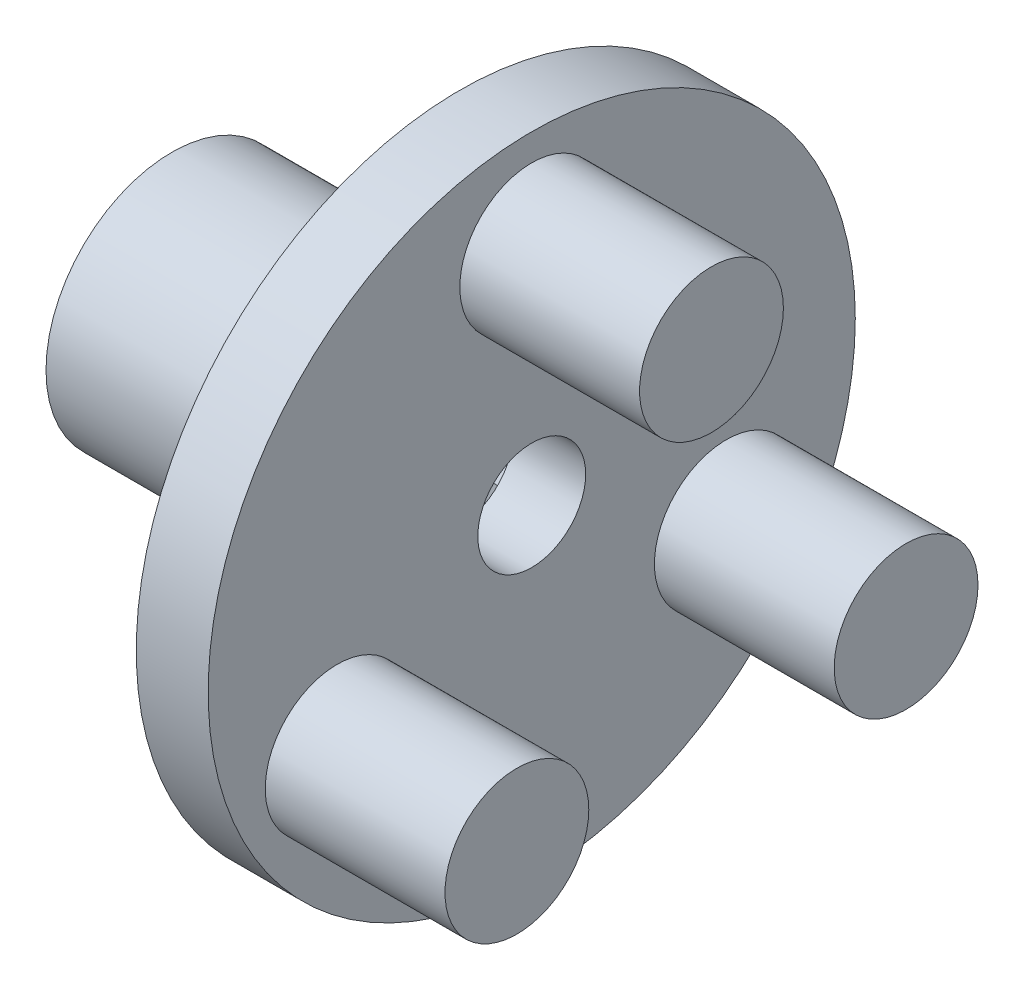
ISO-10303-21;
HEADER;
FILE_DESCRIPTION(('STEP AP214'),'2;1');
FILE_NAME('part.step','',(''),(''),'','','');
FILE_SCHEMA(('AUTOMOTIVE_DESIGN { 1 0 10303 214 1 1 1 1 }'));
ENDSEC;
DATA;
#1=APPLICATION_CONTEXT('core data for automotive mechanical design processes');
#2=APPLICATION_PROTOCOL_DEFINITION('international standard','automotive_design',2000,#1);
#3=PRODUCT_CONTEXT('',#1,'mechanical');
#4=PRODUCT('Part','Part','',(#3));
#5=PRODUCT_RELATED_PRODUCT_CATEGORY('part','',(#4));
#6=PRODUCT_DEFINITION_FORMATION('','',#4);
#7=PRODUCT_DEFINITION_CONTEXT('part definition',#1,'design');
#8=PRODUCT_DEFINITION('design','',#6,#7);
#9=PRODUCT_DEFINITION_SHAPE('','',#8);
#10=(LENGTH_UNIT() NAMED_UNIT(*) SI_UNIT(.MILLI.,.METRE.));
#11=(NAMED_UNIT(*) PLANE_ANGLE_UNIT() SI_UNIT($,.RADIAN.));
#12=(NAMED_UNIT(*) SI_UNIT($,.STERADIAN.) SOLID_ANGLE_UNIT());
#13=UNCERTAINTY_MEASURE_WITH_UNIT(LENGTH_MEASURE(1.E-05),#10,'distance_accuracy_value','');
#14=(GEOMETRIC_REPRESENTATION_CONTEXT(3) GLOBAL_UNCERTAINTY_ASSIGNED_CONTEXT((#13)) GLOBAL_UNIT_ASSIGNED_CONTEXT((#10,
#11,#12)) REPRESENTATION_CONTEXT('',''));
#15=CARTESIAN_POINT('',(0.,0.,0.));
#16=DIRECTION('',(0.,0.,1.));
#17=DIRECTION('',(1.,0.,0.));
#18=AXIS2_PLACEMENT_3D('',#15,#16,#17);
#19=CARTESIAN_POINT('',(2.,0.,0.));
#20=DIRECTION('',(-1.,0.,0.));
#21=DIRECTION('',(0.,0.,1.));
#22=AXIS2_PLACEMENT_3D('',#19,#20,#21);
#23=CYLINDRICAL_SURFACE('',#22,9.);
#24=CARTESIAN_POINT('',(2.,0.,0.));
#25=DIRECTION('',(1.,0.,0.));
#26=DIRECTION('',(0.,0.,-1.));
#27=AXIS2_PLACEMENT_3D('',#24,#25,#26);
#28=CIRCLE('',#27,9.);
#29=CARTESIAN_POINT('',(2.,0.,-9.));
#30=VERTEX_POINT('',#29);
#31=EDGE_CURVE('E49',#30,#30,#28,.T.);
#32=ORIENTED_EDGE('',*,*,#31,.F.);
#33=EDGE_LOOP('',(#32));
#34=FACE_BOUND('',#33,.T.);
#35=CARTESIAN_POINT('',(0.,0.,0.));
#36=DIRECTION('',(1.,0.,0.));
#37=DIRECTION('',(0.,0.,-1.));
#38=AXIS2_PLACEMENT_3D('',#35,#36,#37);
#39=CIRCLE('',#38,9.);
#40=CARTESIAN_POINT('',(0.,0.,-9.));
#41=VERTEX_POINT('',#40);
#42=EDGE_CURVE('E269',#41,#41,#39,.T.);
#43=ORIENTED_EDGE('',*,*,#42,.T.);
#44=EDGE_LOOP('',(#43));
#45=FACE_BOUND('',#44,.T.);
#46=ADVANCED_FACE('F41',(#34,#45),#23,.T.);
#47=CARTESIAN_POINT('',(2.,0.,0.));
#48=DIRECTION('',(1.,0.,0.));
#49=DIRECTION('',(0.,0.,-1.));
#50=AXIS2_PLACEMENT_3D('',#47,#48,#49);
#51=PLANE('',#50);
#52=CARTESIAN_POINT('',(2.,0.,0.));
#53=DIRECTION('',(1.,0.,0.));
#54=DIRECTION('',(0.,0.,-1.));
#55=AXIS2_PLACEMENT_3D('',#52,#53,#54);
#56=CIRCLE('',#55,1.5);
#57=CARTESIAN_POINT('',(2.,0.,-1.5));
#58=VERTEX_POINT('',#57);
#59=EDGE_CURVE('E176',#58,#58,#56,.F.);
#60=ORIENTED_EDGE('',*,*,#59,.T.);
#61=EDGE_LOOP('',(#60));
#62=FACE_BOUND('',#61,.T.);
#63=CARTESIAN_POINT('',(2.,-3.12499999999977,-5.41265877365314));
#64=DIRECTION('',(1.,0.,0.));
#65=DIRECTION('',(0.,0.,-1.));
#66=AXIS2_PLACEMENT_3D('',#63,#64,#65);
#67=CIRCLE('',#66,2.);
#68=CARTESIAN_POINT('',(2.,-3.12499999999977,-7.41265877365314));
#69=VERTEX_POINT('',#68);
#70=EDGE_CURVE('E248',#69,#69,#67,.T.);
#71=ORIENTED_EDGE('',*,*,#70,.F.);
#72=EDGE_LOOP('',(#71));
#73=FACE_BOUND('',#72,.T.);
#74=CARTESIAN_POINT('',(2.,-3.12500000000023,5.41265877365234));
#75=DIRECTION('',(1.,0.,0.));
#76=DIRECTION('',(0.,0.,-1.));
#77=AXIS2_PLACEMENT_3D('',#74,#75,#76);
#78=CIRCLE('',#77,2.);
#79=CARTESIAN_POINT('',(2.,-3.12500000000023,3.41265877365234));
#80=VERTEX_POINT('',#79);
#81=EDGE_CURVE('E253',#80,#80,#78,.T.);
#82=ORIENTED_EDGE('',*,*,#81,.F.);
#83=EDGE_LOOP('',(#82));
#84=FACE_BOUND('',#83,.T.);
#85=CARTESIAN_POINT('',(2.,6.25,0.));
#86=DIRECTION('',(1.,0.,0.));
#87=DIRECTION('',(0.,0.,-1.));
#88=AXIS2_PLACEMENT_3D('',#85,#86,#87);
#89=CIRCLE('',#88,2.);
#90=CARTESIAN_POINT('',(2.,6.25,-2.));
#91=VERTEX_POINT('',#90);
#92=EDGE_CURVE('E261',#91,#91,#89,.T.);
#93=ORIENTED_EDGE('',*,*,#92,.F.);
#94=EDGE_LOOP('',(#93));
#95=FACE_BOUND('',#94,.T.);
#96=ORIENTED_EDGE('',*,*,#31,.T.);
#97=EDGE_LOOP('',(#96));
#98=FACE_BOUND('',#97,.T.);
#99=ADVANCED_FACE('F283',(#62,#73,#84,#95,#98),#51,.T.);
#100=CARTESIAN_POINT('',(0.,0.,0.));
#101=DIRECTION('',(1.,0.,0.));
#102=DIRECTION('',(0.,0.,-1.));
#103=AXIS2_PLACEMENT_3D('',#100,#101,#102);
#104=PLANE('',#103);
#105=CARTESIAN_POINT('',(0.,0.,0.));
#106=DIRECTION('',(1.,0.,0.));
#107=DIRECTION('',(0.,0.,-1.));
#108=AXIS2_PLACEMENT_3D('',#105,#106,#107);
#109=CIRCLE('',#108,5.);
#110=CARTESIAN_POINT('',(0.,0.,-5.));
#111=VERTEX_POINT('',#110);
#112=EDGE_CURVE('E11',#111,#111,#109,.F.);
#113=ORIENTED_EDGE('',*,*,#112,.F.);
#114=EDGE_LOOP('',(#113));
#115=FACE_BOUND('',#114,.T.);
#116=ORIENTED_EDGE('',*,*,#42,.F.);
#117=EDGE_LOOP('',(#116));
#118=FACE_BOUND('',#117,.T.);
#119=ADVANCED_FACE('F280',(#115,#118),#104,.F.);
#120=CARTESIAN_POINT('',(7.,6.25,0.));
#121=DIRECTION('',(-1.,0.,0.));
#122=DIRECTION('',(0.,0.,1.));
#123=AXIS2_PLACEMENT_3D('',#120,#121,#122);
#124=CYLINDRICAL_SURFACE('',#123,2.);
#125=CARTESIAN_POINT('',(7.,6.25,0.));
#126=DIRECTION('',(1.,0.,0.));
#127=DIRECTION('',(0.,0.,-1.));
#128=AXIS2_PLACEMENT_3D('',#125,#126,#127);
#129=CIRCLE('',#128,2.);
#130=CARTESIAN_POINT('',(7.,6.25,-2.));
#131=VERTEX_POINT('',#130);
#132=EDGE_CURVE('E265',#131,#131,#129,.T.);
#133=ORIENTED_EDGE('',*,*,#132,.F.);
#134=EDGE_LOOP('',(#133));
#135=FACE_BOUND('',#134,.T.);
#136=ORIENTED_EDGE('',*,*,#92,.T.);
#137=EDGE_LOOP('',(#136));
#138=FACE_BOUND('',#137,.T.);
#139=ADVANCED_FACE('F282',(#135,#138),#124,.T.);
#140=CARTESIAN_POINT('',(7.,6.25,0.));
#141=DIRECTION('',(1.,0.,0.));
#142=DIRECTION('',(0.,0.,-1.));
#143=AXIS2_PLACEMENT_3D('',#140,#141,#142);
#144=PLANE('',#143);
#145=ORIENTED_EDGE('',*,*,#132,.T.);
#146=EDGE_LOOP('',(#145));
#147=FACE_BOUND('',#146,.T.);
#148=ADVANCED_FACE('F289',(#147),#144,.T.);
#149=CARTESIAN_POINT('',(7.,-3.12500000000023,5.41265877365234));
#150=DIRECTION('',(-1.,0.,0.));
#151=DIRECTION('',(0.,0.,1.));
#152=AXIS2_PLACEMENT_3D('',#149,#150,#151);
#153=CYLINDRICAL_SURFACE('',#152,2.);
#154=CARTESIAN_POINT('',(7.,-3.12500000000023,5.41265877365234));
#155=DIRECTION('',(1.,0.,0.));
#156=DIRECTION('',(0.,0.,-1.));
#157=AXIS2_PLACEMENT_3D('',#154,#155,#156);
#158=CIRCLE('',#157,2.);
#159=CARTESIAN_POINT('',(7.,-3.12500000000023,3.41265877365234));
#160=VERTEX_POINT('',#159);
#161=EDGE_CURVE('E257',#160,#160,#158,.T.);
#162=ORIENTED_EDGE('',*,*,#161,.F.);
#163=EDGE_LOOP('',(#162));
#164=FACE_BOUND('',#163,.T.);
#165=ORIENTED_EDGE('',*,*,#81,.T.);
#166=EDGE_LOOP('',(#165));
#167=FACE_BOUND('',#166,.T.);
#168=ADVANCED_FACE('F450',(#164,#167),#153,.T.);
#169=CARTESIAN_POINT('',(7.,-3.12500000000023,5.41265877365234));
#170=DIRECTION('',(1.,0.,0.));
#171=DIRECTION('',(0.,0.,-1.));
#172=AXIS2_PLACEMENT_3D('',#169,#170,#171);
#173=PLANE('',#172);
#174=ORIENTED_EDGE('',*,*,#161,.T.);
#175=EDGE_LOOP('',(#174));
#176=FACE_BOUND('',#175,.T.);
#177=ADVANCED_FACE('F452',(#176),#173,.T.);
#178=CARTESIAN_POINT('',(7.,-3.12499999999977,-5.41265877365314));
#179=DIRECTION('',(-1.,0.,0.));
#180=DIRECTION('',(0.,0.,1.));
#181=AXIS2_PLACEMENT_3D('',#178,#179,#180);
#182=CYLINDRICAL_SURFACE('',#181,2.);
#183=CARTESIAN_POINT('',(7.,-3.12499999999977,-5.41265877365314));
#184=DIRECTION('',(1.,0.,0.));
#185=DIRECTION('',(0.,0.,-1.));
#186=AXIS2_PLACEMENT_3D('',#183,#184,#185);
#187=CIRCLE('',#186,2.);
#188=CARTESIAN_POINT('',(7.,-3.12499999999977,-7.41265877365314));
#189=VERTEX_POINT('',#188);
#190=EDGE_CURVE('E249',#189,#189,#187,.T.);
#191=ORIENTED_EDGE('',*,*,#190,.F.);
#192=EDGE_LOOP('',(#191));
#193=FACE_BOUND('',#192,.T.);
#194=ORIENTED_EDGE('',*,*,#70,.T.);
#195=EDGE_LOOP('',(#194));
#196=FACE_BOUND('',#195,.T.);
#197=ADVANCED_FACE('F349',(#193,#196),#182,.T.);
#198=CARTESIAN_POINT('',(7.,-3.12499999999977,-5.41265877365314));
#199=DIRECTION('',(1.,0.,0.));
#200=DIRECTION('',(0.,0.,-1.));
#201=AXIS2_PLACEMENT_3D('',#198,#199,#200);
#202=PLANE('',#201);
#203=ORIENTED_EDGE('',*,*,#190,.T.);
#204=EDGE_LOOP('',(#203));
#205=FACE_BOUND('',#204,.T.);
#206=ADVANCED_FACE('F341',(#205),#202,.T.);
#207=CARTESIAN_POINT('',(-0.01,0.,0.));
#208=DIRECTION('',(-1.,0.,0.));
#209=DIRECTION('',(0.,0.,1.));
#210=AXIS2_PLACEMENT_3D('',#207,#208,#209);
#211=PLANE('',#210);
#212=CARTESIAN_POINT('',(-0.01,0.,0.));
#213=DIRECTION('',(-1.,0.,0.));
#214=DIRECTION('',(0.,0.,1.));
#215=AXIS2_PLACEMENT_3D('',#212,#213,#214);
#216=CIRCLE('',#215,3.5);
#217=CARTESIAN_POINT('',(-0.01,0.,3.5));
#218=VERTEX_POINT('',#217);
#219=EDGE_CURVE('E206',#218,#218,#216,.T.);
#220=ORIENTED_EDGE('',*,*,#219,.F.);
#221=EDGE_LOOP('',(#220));
#222=FACE_BOUND('',#221,.T.);
#223=CARTESIAN_POINT('',(-0.01,0.,0.));
#224=DIRECTION('',(-1.,0.,0.));
#225=DIRECTION('',(0.,0.,1.));
#226=AXIS2_PLACEMENT_3D('',#223,#224,#225);
#227=CIRCLE('',#226,5.);
#228=CARTESIAN_POINT('',(-0.01,0.,-5.));
#229=VERTEX_POINT('',#228);
#230=EDGE_CURVE('E244',#229,#229,#227,.T.);
#231=ORIENTED_EDGE('',*,*,#230,.T.);
#232=EDGE_LOOP('',(#231));
#233=FACE_BOUND('',#232,.T.);
#234=ADVANCED_FACE('F335',(#222,#233),#211,.T.);
#235=CARTESIAN_POINT('',(-0.01,0.,0.));
#236=DIRECTION('',(1.,0.,0.));
#237=DIRECTION('',(0.,0.,-1.));
#238=AXIS2_PLACEMENT_3D('',#235,#236,#237);
#239=CYLINDRICAL_SURFACE('',#238,5.);
#240=CARTESIAN_POINT('',(-0.01,0.,-5.));
#241=CARTESIAN_POINT('',(-0.00989583333333333,0.,-5.));
#242=CARTESIAN_POINT('',(-0.00979166666666667,0.,-5.));
#243=CARTESIAN_POINT('',(-0.00958333333333333,0.,-5.));
#244=CARTESIAN_POINT('',(-0.00947916666666667,0.,-5.));
#245=CARTESIAN_POINT('',(-0.00927083333333333,0.,-5.));
#246=CARTESIAN_POINT('',(-0.00916666666666667,0.,-5.));
#247=CARTESIAN_POINT('',(-0.00895833333333333,0.,-5.));
#248=CARTESIAN_POINT('',(-0.00885416666666667,0.,-5.));
#249=CARTESIAN_POINT('',(-0.00864583333333333,0.,-5.));
#250=CARTESIAN_POINT('',(-0.00854166666666667,0.,-5.));
#251=CARTESIAN_POINT('',(-0.00833333333333333,0.,-5.));
#252=CARTESIAN_POINT('',(-0.00822916666666667,0.,-5.));
#253=CARTESIAN_POINT('',(-0.00802083333333333,0.,-5.));
#254=CARTESIAN_POINT('',(-0.00791666666666667,0.,-5.));
#255=CARTESIAN_POINT('',(-0.00770833333333333,0.,-5.));
#256=CARTESIAN_POINT('',(-0.00760416666666667,0.,-5.));
#257=CARTESIAN_POINT('',(-0.00739583333333333,0.,-5.));
#258=CARTESIAN_POINT('',(-0.00729166666666667,0.,-5.));
#259=CARTESIAN_POINT('',(-0.00708333333333333,0.,-5.));
#260=CARTESIAN_POINT('',(-0.00697916666666667,0.,-5.));
#261=CARTESIAN_POINT('',(-0.00677083333333333,0.,-5.));
#262=CARTESIAN_POINT('',(-0.00666666666666667,0.,-5.));
#263=CARTESIAN_POINT('',(-0.00645833333333333,0.,-5.));
#264=CARTESIAN_POINT('',(-0.00635416666666667,0.,-5.));
#265=CARTESIAN_POINT('',(-0.00614583333333333,0.,-5.));
#266=CARTESIAN_POINT('',(-0.00604166666666667,0.,-5.));
#267=CARTESIAN_POINT('',(-0.00583333333333333,0.,-5.));
#268=CARTESIAN_POINT('',(-0.00572916666666667,0.,-5.));
#269=CARTESIAN_POINT('',(-0.00552083333333333,0.,-5.));
#270=CARTESIAN_POINT('',(-0.00541666666666667,0.,-5.));
#271=CARTESIAN_POINT('',(-0.00520833333333333,0.,-5.));
#272=CARTESIAN_POINT('',(-0.00510416666666667,0.,-5.));
#273=CARTESIAN_POINT('',(-0.00489583333333333,0.,-5.));
#274=CARTESIAN_POINT('',(-0.00479166666666667,0.,-5.));
#275=CARTESIAN_POINT('',(-0.00458333333333333,0.,-5.));
#276=CARTESIAN_POINT('',(-0.00447916666666667,0.,-5.));
#277=CARTESIAN_POINT('',(-0.00427083333333333,0.,-5.));
#278=CARTESIAN_POINT('',(-0.00416666666666667,0.,-5.));
#279=CARTESIAN_POINT('',(-0.00395833333333333,0.,-5.));
#280=CARTESIAN_POINT('',(-0.00385416666666667,0.,-5.));
#281=CARTESIAN_POINT('',(-0.00364583333333333,0.,-5.));
#282=CARTESIAN_POINT('',(-0.00354166666666667,0.,-5.));
#283=CARTESIAN_POINT('',(-0.00333333333333333,0.,-5.));
#284=CARTESIAN_POINT('',(-0.00322916666666667,0.,-5.));
#285=CARTESIAN_POINT('',(-0.00302083333333333,0.,-5.));
#286=CARTESIAN_POINT('',(-0.00291666666666667,0.,-5.));
#287=CARTESIAN_POINT('',(-0.00270833333333333,0.,-5.));
#288=CARTESIAN_POINT('',(-0.00260416666666667,0.,-5.));
#289=CARTESIAN_POINT('',(-0.00239583333333333,0.,-5.));
#290=CARTESIAN_POINT('',(-0.00229166666666667,0.,-5.));
#291=CARTESIAN_POINT('',(-0.00208333333333333,0.,-5.));
#292=CARTESIAN_POINT('',(-0.00197916666666667,0.,-5.));
#293=CARTESIAN_POINT('',(-0.00177083333333333,0.,-5.));
#294=CARTESIAN_POINT('',(-0.00166666666666667,0.,-5.));
#295=CARTESIAN_POINT('',(-0.00145833333333333,0.,-5.));
#296=CARTESIAN_POINT('',(-0.00135416666666667,0.,-5.));
#297=CARTESIAN_POINT('',(-0.00114583333333333,0.,-5.));
#298=CARTESIAN_POINT('',(-0.00104166666666667,0.,-5.));
#299=CARTESIAN_POINT('',(-0.000833333333333334,0.,-5.));
#300=CARTESIAN_POINT('',(-0.000729166666666667,0.,-5.));
#301=CARTESIAN_POINT('',(-0.000520833333333334,0.,-5.));
#302=CARTESIAN_POINT('',(-0.000416666666666667,0.,-5.));
#303=CARTESIAN_POINT('',(-0.000208333333333334,0.,-5.));
#304=CARTESIAN_POINT('',(-0.000104166666666667,0.,-5.));
#305=CARTESIAN_POINT('',(0.,0.,-5.));
#306=B_SPLINE_CURVE_WITH_KNOTS('',3,(#240,#241,#242,#243,#244,#245,#246,#247,#248,#249,#250,
#251,#252,#253,#254,#255,#256,#257,#258,#259,#260,#261,#262,#263,#264,#265,#266,#267,#268,#269,
#270,#271,#272,#273,#274,#275,#276,#277,#278,#279,#280,#281,#282,#283,#284,#285,#286,#287,#288,
#289,#290,#291,#292,#293,#294,#295,#296,#297,#298,#299,#300,#301,#302,#303,#304,#305),
.UNSPECIFIED.,.F.,.F.,(4,2,2,2,2,2,2,2,2,2,2,2,2,2,2,2,2,2,2,2,2,2,2,2,2,2,2,2,2,2,2,2,4),(0.,
0.000312499999999999,0.000624999999999998,0.000937499999999999,0.00125,0.0015625,0.001875,
0.0021875,0.0025,0.0028125,0.003125,0.0034375,0.00375,0.0040625,0.004375,0.0046875,0.005,
0.0053125,0.005625,0.0059375,0.00625,0.0065625,0.006875,0.0071875,0.0075,0.0078125,0.008125,
0.0084375,0.00875,0.0090625,0.009375,0.0096875,0.01),.UNSPECIFIED.);
#307=EDGE_CURVE('BSEAM340',#229,#111,#306,.T.);
#308=ORIENTED_EDGE('',*,*,#230,.F.);
#309=ORIENTED_EDGE('',*,*,#112,.T.);
#310=ORIENTED_EDGE('',*,*,#307,.T.);
#311=ORIENTED_EDGE('',*,*,#307,.F.);
#312=EDGE_LOOP('',(#308,#310,#309,#311));
#313=FACE_BOUND('',#312,.T.);
#314=ADVANCED_FACE('F340',(#313),#239,.T.);
#315=CARTESIAN_POINT('',(-8.01,0.,0.));
#316=DIRECTION('',(1.,0.,0.));
#317=DIRECTION('',(0.,0.,-1.));
#318=AXIS2_PLACEMENT_3D('',#315,#316,#317);
#319=CYLINDRICAL_SURFACE('',#318,2.6);
#320=CARTESIAN_POINT('',(-0.01,0.,0.));
#321=DIRECTION('',(-1.,0.,0.));
#322=DIRECTION('',(0.,0.,1.));
#323=AXIS2_PLACEMENT_3D('',#320,#321,#322);
#324=CIRCLE('',#323,2.6);
#325=CARTESIAN_POINT('',(-0.01,-1.20428047928488,2.30428047928488));
#326=VERTEX_POINT('',#325);
#327=CARTESIAN_POINT('',(-0.01,1.20428047928488,2.30428047928488));
#328=VERTEX_POINT('',#327);
#329=EDGE_CURVE('E171',#326,#328,#324,.T.);
#330=ORIENTED_EDGE('',*,*,#329,.F.);
#331=DIRECTION('',(1.,0.,0.));
#332=VECTOR('',#331,1.);
#333=CARTESIAN_POINT('',(-8.01,-1.20428047928488,2.30428047928488));
#334=LINE('',#333,#332);
#335=CARTESIAN_POINT('',(-8.01,-1.20428047928488,2.30428047928488));
#336=VERTEX_POINT('',#335);
#337=EDGE_CURVE('E110',#336,#326,#334,.T.);
#338=ORIENTED_EDGE('',*,*,#337,.F.);
#339=CARTESIAN_POINT('',(-8.01,0.,0.));
#340=DIRECTION('',(-1.,0.,0.));
#341=DIRECTION('',(0.,0.,1.));
#342=AXIS2_PLACEMENT_3D('',#339,#340,#341);
#343=CIRCLE('',#342,2.6);
#344=CARTESIAN_POINT('',(-8.01,1.20428047928488,2.30428047928488));
#345=VERTEX_POINT('',#344);
#346=EDGE_CURVE('E158',#336,#345,#343,.T.);
#347=ORIENTED_EDGE('',*,*,#346,.T.);
#348=DIRECTION('',(1.,0.,0.));
#349=VECTOR('',#348,1.);
#350=CARTESIAN_POINT('',(-8.01,1.20428047928488,2.30428047928488));
#351=LINE('',#350,#349);
#352=EDGE_CURVE('E105',#345,#328,#351,.T.);
#353=ORIENTED_EDGE('',*,*,#352,.T.);
#354=EDGE_LOOP('',(#330,#338,#347,#353));
#355=FACE_BOUND('',#354,.T.);
#356=ADVANCED_FACE('F347',(#355),#319,.F.);
#357=CARTESIAN_POINT('',(-8.01,-1.20428047928488,0.));
#358=DIRECTION('',(0.,1.,0.));
#359=DIRECTION('',(0.,0.,1.));
#360=AXIS2_PLACEMENT_3D('',#357,#358,#359);
#361=PLANE('',#360);
#362=DIRECTION('',(0.,0.,1.));
#363=VECTOR('',#362,1.);
#364=CARTESIAN_POINT('',(-0.01,-1.20428047928488,0.));
#365=LINE('',#364,#363);
#366=CARTESIAN_POINT('',(-0.01,-1.20428047928488,1.20428047928488));
#367=VERTEX_POINT('',#366);
#368=EDGE_CURVE('E175',#367,#326,#365,.T.);
#369=ORIENTED_EDGE('',*,*,#368,.F.);
#370=DIRECTION('',(1.,0.,0.));
#371=VECTOR('',#370,1.);
#372=CARTESIAN_POINT('',(-8.01,-1.20428047928488,1.20428047928488));
#373=LINE('',#372,#371);
#374=CARTESIAN_POINT('',(-8.01,-1.20428047928488,1.20428047928488));
#375=VERTEX_POINT('',#374);
#376=EDGE_CURVE('E235',#375,#367,#373,.T.);
#377=ORIENTED_EDGE('',*,*,#376,.F.);
#378=DIRECTION('',(0.,0.,1.));
#379=VECTOR('',#378,1.);
#380=CARTESIAN_POINT('',(-8.01,-1.20428047928488,0.));
#381=LINE('',#380,#379);
#382=EDGE_CURVE('E415',#375,#336,#381,.T.);
#383=ORIENTED_EDGE('',*,*,#382,.T.);
#384=ORIENTED_EDGE('',*,*,#337,.T.);
#385=EDGE_LOOP('',(#369,#377,#383,#384));
#386=FACE_BOUND('',#385,.T.);
#387=ADVANCED_FACE('F394',(#386),#361,.T.);
#388=CARTESIAN_POINT('',(-8.01,0.,1.20428047928488));
#389=DIRECTION('',(0.,0.,-1.));
#390=DIRECTION('',(-1.,0.,0.));
#391=AXIS2_PLACEMENT_3D('',#388,#389,#390);
#392=PLANE('',#391);
#393=DIRECTION('',(0.,1.,0.));
#394=VECTOR('',#393,1.);
#395=CARTESIAN_POINT('',(-0.01,0.,1.20428047928488));
#396=LINE('',#395,#394);
#397=CARTESIAN_POINT('',(-0.01,-2.30428047928488,1.20428047928488));
#398=VERTEX_POINT('',#397);
#399=EDGE_CURVE('E181',#398,#367,#396,.T.);
#400=ORIENTED_EDGE('',*,*,#399,.F.);
#401=DIRECTION('',(1.,0.,0.));
#402=VECTOR('',#401,1.);
#403=CARTESIAN_POINT('',(-8.01,-2.30428047928488,1.20428047928488));
#404=LINE('',#403,#402);
#405=CARTESIAN_POINT('',(-8.01,-2.30428047928488,1.20428047928488));
#406=VERTEX_POINT('',#405);
#407=EDGE_CURVE('E232',#406,#398,#404,.T.);
#408=ORIENTED_EDGE('',*,*,#407,.F.);
#409=DIRECTION('',(0.,1.,0.));
#410=VECTOR('',#409,1.);
#411=CARTESIAN_POINT('',(-8.01,0.,1.20428047928488));
#412=LINE('',#411,#410);
#413=EDGE_CURVE('E410',#406,#375,#412,.T.);
#414=ORIENTED_EDGE('',*,*,#413,.T.);
#415=ORIENTED_EDGE('',*,*,#376,.T.);
#416=EDGE_LOOP('',(#400,#408,#414,#415));
#417=FACE_BOUND('',#416,.T.);
#418=ADVANCED_FACE('F391',(#417),#392,.T.);
#419=CARTESIAN_POINT('',(-0.01,-2.30428047928488,-1.20428047928488));
#420=VERTEX_POINT('',#419);
#421=EDGE_CURVE('E177',#420,#398,#324,.T.);
#422=ORIENTED_EDGE('',*,*,#421,.F.);
#423=DIRECTION('',(1.,0.,0.));
#424=VECTOR('',#423,1.);
#425=CARTESIAN_POINT('',(-8.01,-2.30428047928488,-1.20428047928488));
#426=LINE('',#425,#424);
#427=CARTESIAN_POINT('',(-8.01,-2.30428047928488,-1.20428047928488));
#428=VERTEX_POINT('',#427);
#429=EDGE_CURVE('E229',#428,#420,#426,.T.);
#430=ORIENTED_EDGE('',*,*,#429,.F.);
#431=EDGE_CURVE('E414',#428,#406,#343,.T.);
#432=ORIENTED_EDGE('',*,*,#431,.T.);
#433=ORIENTED_EDGE('',*,*,#407,.T.);
#434=EDGE_LOOP('',(#422,#430,#432,#433));
#435=FACE_BOUND('',#434,.T.);
#436=ADVANCED_FACE('F389',(#435),#319,.F.);
#437=CARTESIAN_POINT('',(-8.01,0.,-1.20428047928488));
#438=DIRECTION('',(0.,0.,-1.));
#439=DIRECTION('',(-1.,0.,0.));
#440=AXIS2_PLACEMENT_3D('',#437,#438,#439);
#441=PLANE('',#440);
#442=DIRECTION('',(0.,1.,0.));
#443=VECTOR('',#442,1.);
#444=CARTESIAN_POINT('',(-0.01,0.,-1.20428047928488));
#445=LINE('',#444,#443);
#446=CARTESIAN_POINT('',(-0.01,-1.20428047928488,-1.20428047928488));
#447=VERTEX_POINT('',#446);
#448=EDGE_CURVE('E185',#420,#447,#445,.T.);
#449=ORIENTED_EDGE('',*,*,#448,.T.);
#450=DIRECTION('',(1.,0.,0.));
#451=VECTOR('',#450,1.);
#452=CARTESIAN_POINT('',(-8.01,-1.20428047928488,-1.20428047928488));
#453=LINE('',#452,#451);
#454=CARTESIAN_POINT('',(-8.01,-1.20428047928488,-1.20428047928488));
#455=VERTEX_POINT('',#454);
#456=EDGE_CURVE('E226',#455,#447,#453,.T.);
#457=ORIENTED_EDGE('',*,*,#456,.F.);
#458=DIRECTION('',(0.,1.,0.));
#459=VECTOR('',#458,1.);
#460=CARTESIAN_POINT('',(-8.01,0.,-1.20428047928488));
#461=LINE('',#460,#459);
#462=EDGE_CURVE('E419',#428,#455,#461,.T.);
#463=ORIENTED_EDGE('',*,*,#462,.F.);
#464=ORIENTED_EDGE('',*,*,#429,.T.);
#465=EDGE_LOOP('',(#449,#457,#463,#464));
#466=FACE_BOUND('',#465,.T.);
#467=ADVANCED_FACE('F385',(#466),#441,.F.);
#468=CARTESIAN_POINT('',(-8.01,-1.20428047928488,0.));
#469=DIRECTION('',(0.,1.,0.));
#470=DIRECTION('',(0.,0.,1.));
#471=AXIS2_PLACEMENT_3D('',#468,#469,#470);
#472=PLANE('',#471);
#473=DIRECTION('',(0.,0.,1.));
#474=VECTOR('',#473,1.);
#475=CARTESIAN_POINT('',(-0.01,-1.20428047928488,0.));
#476=LINE('',#475,#474);
#477=CARTESIAN_POINT('',(-0.01,-1.20428047928488,-2.30428047928488));
#478=VERTEX_POINT('',#477);
#479=EDGE_CURVE('E189',#478,#447,#476,.T.);
#480=ORIENTED_EDGE('',*,*,#479,.F.);
#481=DIRECTION('',(1.,0.,0.));
#482=VECTOR('',#481,1.);
#483=CARTESIAN_POINT('',(-8.01,-1.20428047928488,-2.30428047928488));
#484=LINE('',#483,#482);
#485=CARTESIAN_POINT('',(-8.01,-1.20428047928488,-2.30428047928488));
#486=VERTEX_POINT('',#485);
#487=EDGE_CURVE('E223',#486,#478,#484,.T.);
#488=ORIENTED_EDGE('',*,*,#487,.F.);
#489=DIRECTION('',(0.,0.,1.));
#490=VECTOR('',#489,1.);
#491=CARTESIAN_POINT('',(-8.01,-1.20428047928488,0.));
#492=LINE('',#491,#490);
#493=EDGE_CURVE('E424',#486,#455,#492,.T.);
#494=ORIENTED_EDGE('',*,*,#493,.T.);
#495=ORIENTED_EDGE('',*,*,#456,.T.);
#496=EDGE_LOOP('',(#480,#488,#494,#495));
#497=FACE_BOUND('',#496,.T.);
#498=ADVANCED_FACE('F382',(#497),#472,.T.);
#499=CARTESIAN_POINT('',(-0.01,1.20428047928488,-2.30428047928488));
#500=VERTEX_POINT('',#499);
#501=EDGE_CURVE('E193',#500,#478,#324,.T.);
#502=ORIENTED_EDGE('',*,*,#501,.F.);
#503=DIRECTION('',(1.,0.,0.));
#504=VECTOR('',#503,1.);
#505=CARTESIAN_POINT('',(-8.01,1.20428047928488,-2.30428047928488));
#506=LINE('',#505,#504);
#507=CARTESIAN_POINT('',(-8.01,1.20428047928488,-2.30428047928488));
#508=VERTEX_POINT('',#507);
#509=EDGE_CURVE('E220',#508,#500,#506,.T.);
#510=ORIENTED_EDGE('',*,*,#509,.F.);
#511=EDGE_CURVE('E157',#508,#486,#343,.T.);
#512=ORIENTED_EDGE('',*,*,#511,.T.);
#513=ORIENTED_EDGE('',*,*,#487,.T.);
#514=EDGE_LOOP('',(#502,#510,#512,#513));
#515=FACE_BOUND('',#514,.T.);
#516=ADVANCED_FACE('F374',(#515),#319,.F.);
#517=CARTESIAN_POINT('',(-8.01,1.20428047928488,0.));
#518=DIRECTION('',(0.,1.,0.));
#519=DIRECTION('',(0.,0.,1.));
#520=AXIS2_PLACEMENT_3D('',#517,#518,#519);
#521=PLANE('',#520);
#522=DIRECTION('',(0.,0.,1.));
#523=VECTOR('',#522,1.);
#524=CARTESIAN_POINT('',(-0.01,1.20428047928488,0.));
#525=LINE('',#524,#523);
#526=CARTESIAN_POINT('',(-0.01,1.20428047928488,-1.20428047928488));
#527=VERTEX_POINT('',#526);
#528=EDGE_CURVE('E194',#500,#527,#525,.T.);
#529=ORIENTED_EDGE('',*,*,#528,.T.);
#530=DIRECTION('',(1.,0.,0.));
#531=VECTOR('',#530,1.);
#532=CARTESIAN_POINT('',(-8.01,1.20428047928488,-1.20428047928488));
#533=LINE('',#532,#531);
#534=CARTESIAN_POINT('',(-8.01,1.20428047928488,-1.20428047928488));
#535=VERTEX_POINT('',#534);
#536=EDGE_CURVE('E216',#535,#527,#533,.T.);
#537=ORIENTED_EDGE('',*,*,#536,.F.);
#538=DIRECTION('',(0.,0.,1.));
#539=VECTOR('',#538,1.);
#540=CARTESIAN_POINT('',(-8.01,1.20428047928488,0.));
#541=LINE('',#540,#539);
#542=EDGE_CURVE('E427',#508,#535,#541,.T.);
#543=ORIENTED_EDGE('',*,*,#542,.F.);
#544=ORIENTED_EDGE('',*,*,#509,.T.);
#545=EDGE_LOOP('',(#529,#537,#543,#544));
#546=FACE_BOUND('',#545,.T.);
#547=ADVANCED_FACE('F377',(#546),#521,.F.);
#548=CARTESIAN_POINT('',(-8.01,0.,-1.20428047928488));
#549=DIRECTION('',(0.,0.,-1.));
#550=DIRECTION('',(-1.,0.,0.));
#551=AXIS2_PLACEMENT_3D('',#548,#549,#550);
#552=PLANE('',#551);
#553=DIRECTION('',(0.,1.,0.));
#554=VECTOR('',#553,1.);
#555=CARTESIAN_POINT('',(-0.01,0.,-1.20428047928488));
#556=LINE('',#555,#554);
#557=CARTESIAN_POINT('',(-0.01,2.30428047928488,-1.20428047928488));
#558=VERTEX_POINT('',#557);
#559=EDGE_CURVE('E197',#527,#558,#556,.T.);
#560=ORIENTED_EDGE('',*,*,#559,.T.);
#561=DIRECTION('',(1.,0.,0.));
#562=VECTOR('',#561,1.);
#563=CARTESIAN_POINT('',(-8.01,2.30428047928488,-1.20428047928488));
#564=LINE('',#563,#562);
#565=CARTESIAN_POINT('',(-8.01,2.30428047928488,-1.20428047928488));
#566=VERTEX_POINT('',#565);
#567=EDGE_CURVE('E146',#566,#558,#564,.T.);
#568=ORIENTED_EDGE('',*,*,#567,.F.);
#569=DIRECTION('',(0.,1.,0.));
#570=VECTOR('',#569,1.);
#571=CARTESIAN_POINT('',(-8.01,0.,-1.20428047928488));
#572=LINE('',#571,#570);
#573=EDGE_CURVE('E153',#535,#566,#572,.T.);
#574=ORIENTED_EDGE('',*,*,#573,.F.);
#575=ORIENTED_EDGE('',*,*,#536,.T.);
#576=EDGE_LOOP('',(#560,#568,#574,#575));
#577=FACE_BOUND('',#576,.T.);
#578=ADVANCED_FACE('F373',(#577),#552,.F.);
#579=CARTESIAN_POINT('',(-0.01,2.30428047928488,1.20428047928488));
#580=VERTEX_POINT('',#579);
#581=EDGE_CURVE('E143',#580,#558,#324,.T.);
#582=ORIENTED_EDGE('',*,*,#581,.F.);
#583=DIRECTION('',(1.,0.,0.));
#584=VECTOR('',#583,1.);
#585=CARTESIAN_POINT('',(-8.01,2.30428047928488,1.20428047928488));
#586=LINE('',#585,#584);
#587=CARTESIAN_POINT('',(-8.01,2.30428047928488,1.20428047928488));
#588=VERTEX_POINT('',#587);
#589=EDGE_CURVE('E138',#588,#580,#586,.T.);
#590=ORIENTED_EDGE('',*,*,#589,.F.);
#591=EDGE_CURVE('E141',#588,#566,#343,.T.);
#592=ORIENTED_EDGE('',*,*,#591,.T.);
#593=ORIENTED_EDGE('',*,*,#567,.T.);
#594=EDGE_LOOP('',(#582,#590,#592,#593));
#595=FACE_BOUND('',#594,.T.);
#596=ADVANCED_FACE('F140',(#595),#319,.F.);
#597=CARTESIAN_POINT('',(-8.01,0.,1.20428047928488));
#598=DIRECTION('',(0.,0.,-1.));
#599=DIRECTION('',(-1.,0.,0.));
#600=AXIS2_PLACEMENT_3D('',#597,#598,#599);
#601=PLANE('',#600);
#602=DIRECTION('',(0.,1.,0.));
#603=VECTOR('',#602,1.);
#604=CARTESIAN_POINT('',(-0.01,0.,1.20428047928488));
#605=LINE('',#604,#603);
#606=CARTESIAN_POINT('',(-0.01,1.20428047928488,1.20428047928488));
#607=VERTEX_POINT('',#606);
#608=EDGE_CURVE('E56',#607,#580,#605,.T.);
#609=ORIENTED_EDGE('',*,*,#608,.F.);
#610=DIRECTION('',(1.,0.,0.));
#611=VECTOR('',#610,1.);
#612=CARTESIAN_POINT('',(-8.01,1.20428047928488,1.20428047928488));
#613=LINE('',#612,#611);
#614=CARTESIAN_POINT('',(-8.01,1.20428047928488,1.20428047928488));
#615=VERTEX_POINT('',#614);
#616=EDGE_CURVE('E147',#615,#607,#613,.T.);
#617=ORIENTED_EDGE('',*,*,#616,.F.);
#618=DIRECTION('',(0.,1.,0.));
#619=VECTOR('',#618,1.);
#620=CARTESIAN_POINT('',(-8.01,0.,1.20428047928488));
#621=LINE('',#620,#619);
#622=EDGE_CURVE('E151',#615,#588,#621,.T.);
#623=ORIENTED_EDGE('',*,*,#622,.T.);
#624=ORIENTED_EDGE('',*,*,#589,.T.);
#625=EDGE_LOOP('',(#609,#617,#623,#624));
#626=FACE_BOUND('',#625,.T.);
#627=ADVANCED_FACE('F159',(#626),#601,.T.);
#628=CARTESIAN_POINT('',(-8.01,1.20428047928488,0.));
#629=DIRECTION('',(0.,1.,0.));
#630=DIRECTION('',(0.,0.,1.));
#631=AXIS2_PLACEMENT_3D('',#628,#629,#630);
#632=PLANE('',#631);
#633=DIRECTION('',(0.,0.,1.));
#634=VECTOR('',#633,1.);
#635=CARTESIAN_POINT('',(-0.01,1.20428047928488,0.));
#636=LINE('',#635,#634);
#637=EDGE_CURVE('E203',#607,#328,#636,.T.);
#638=ORIENTED_EDGE('',*,*,#637,.T.);
#639=ORIENTED_EDGE('',*,*,#352,.F.);
#640=DIRECTION('',(0.,0.,1.));
#641=VECTOR('',#640,1.);
#642=CARTESIAN_POINT('',(-8.01,1.20428047928488,0.));
#643=LINE('',#642,#641);
#644=EDGE_CURVE('E65',#615,#345,#643,.T.);
#645=ORIENTED_EDGE('',*,*,#644,.F.);
#646=ORIENTED_EDGE('',*,*,#616,.T.);
#647=EDGE_LOOP('',(#638,#639,#645,#646));
#648=FACE_BOUND('',#647,.T.);
#649=ADVANCED_FACE('F358',(#648),#632,.F.);
#650=CARTESIAN_POINT('',(-8.01,0.,0.));
#651=DIRECTION('',(1.,0.,0.));
#652=DIRECTION('',(0.,0.,-1.));
#653=AXIS2_PLACEMENT_3D('',#650,#651,#652);
#654=CYLINDRICAL_SURFACE('',#653,3.5);
#655=CARTESIAN_POINT('',(-8.01,0.,0.));
#656=DIRECTION('',(-1.,0.,0.));
#657=DIRECTION('',(0.,0.,1.));
#658=AXIS2_PLACEMENT_3D('',#655,#656,#657);
#659=CIRCLE('',#658,3.5);
#660=CARTESIAN_POINT('',(-8.01,0.,3.5));
#661=VERTEX_POINT('',#660);
#662=EDGE_CURVE('E163',#661,#661,#659,.T.);
#663=ORIENTED_EDGE('',*,*,#662,.F.);
#664=EDGE_LOOP('',(#663));
#665=FACE_BOUND('',#664,.T.);
#666=ORIENTED_EDGE('',*,*,#219,.T.);
#667=EDGE_LOOP('',(#666));
#668=FACE_BOUND('',#667,.T.);
#669=ADVANCED_FACE('F357',(#665,#668),#654,.T.);
#670=CARTESIAN_POINT('',(-8.01,0.,0.));
#671=DIRECTION('',(-1.,0.,0.));
#672=DIRECTION('',(0.,0.,1.));
#673=AXIS2_PLACEMENT_3D('',#670,#671,#672);
#674=PLANE('',#673);
#675=ORIENTED_EDGE('',*,*,#346,.F.);
#676=ORIENTED_EDGE('',*,*,#382,.F.);
#677=ORIENTED_EDGE('',*,*,#413,.F.);
#678=ORIENTED_EDGE('',*,*,#431,.F.);
#679=ORIENTED_EDGE('',*,*,#462,.T.);
#680=ORIENTED_EDGE('',*,*,#493,.F.);
#681=ORIENTED_EDGE('',*,*,#511,.F.);
#682=ORIENTED_EDGE('',*,*,#542,.T.);
#683=ORIENTED_EDGE('',*,*,#573,.T.);
#684=ORIENTED_EDGE('',*,*,#591,.F.);
#685=ORIENTED_EDGE('',*,*,#622,.F.);
#686=ORIENTED_EDGE('',*,*,#644,.T.);
#687=EDGE_LOOP('',(#675,#676,#677,#678,#679,#680,#681,#682,#683,#684,#685,#686));
#688=FACE_BOUND('',#687,.T.);
#689=ORIENTED_EDGE('',*,*,#662,.T.);
#690=EDGE_LOOP('',(#689));
#691=FACE_BOUND('',#690,.T.);
#692=ADVANCED_FACE('F149',(#688,#691),#674,.T.);
#693=CARTESIAN_POINT('',(-0.01,0.,0.));
#694=DIRECTION('',(1.,0.,0.));
#695=DIRECTION('',(0.,0.,-1.));
#696=AXIS2_PLACEMENT_3D('',#693,#694,#695);
#697=CYLINDRICAL_SURFACE('',#696,1.5);
#698=CARTESIAN_POINT('',(-0.01,0.,0.));
#699=DIRECTION('',(-1.,0.,0.));
#700=DIRECTION('',(0.,0.,1.));
#701=AXIS2_PLACEMENT_3D('',#698,#699,#700);
#702=CIRCLE('',#701,1.5);
#703=CARTESIAN_POINT('',(-0.01,0.,-1.5));
#704=VERTEX_POINT('',#703);
#705=EDGE_CURVE('E240',#704,#704,#702,.T.);
#706=CARTESIAN_POINT('',(-0.01,0.,-1.5));
#707=CARTESIAN_POINT('',(0.0109375,0.,-1.5));
#708=CARTESIAN_POINT('',(0.031875,0.,-1.5));
#709=CARTESIAN_POINT('',(0.07375,0.,-1.5));
#710=CARTESIAN_POINT('',(0.0946875,0.,-1.5));
#711=CARTESIAN_POINT('',(0.1365625,0.,-1.5));
#712=CARTESIAN_POINT('',(0.1575,0.,-1.5));
#713=CARTESIAN_POINT('',(0.199375,0.,-1.5));
#714=CARTESIAN_POINT('',(0.2203125,0.,-1.5));
#715=CARTESIAN_POINT('',(0.2621875,0.,-1.5));
#716=CARTESIAN_POINT('',(0.283125,0.,-1.5));
#717=CARTESIAN_POINT('',(0.325,0.,-1.5));
#718=CARTESIAN_POINT('',(0.3459375,0.,-1.5));
#719=CARTESIAN_POINT('',(0.3878125,0.,-1.5));
#720=CARTESIAN_POINT('',(0.40875,0.,-1.5));
#721=CARTESIAN_POINT('',(0.450625,0.,-1.5));
#722=CARTESIAN_POINT('',(0.4715625,0.,-1.5));
#723=CARTESIAN_POINT('',(0.5134375,0.,-1.5));
#724=CARTESIAN_POINT('',(0.534375,0.,-1.5));
#725=CARTESIAN_POINT('',(0.57625,0.,-1.5));
#726=CARTESIAN_POINT('',(0.5971875,0.,-1.5));
#727=CARTESIAN_POINT('',(0.6390625,0.,-1.5));
#728=CARTESIAN_POINT('',(0.66,0.,-1.5));
#729=CARTESIAN_POINT('',(0.701875,0.,-1.5));
#730=CARTESIAN_POINT('',(0.7228125,0.,-1.5));
#731=CARTESIAN_POINT('',(0.7646875,0.,-1.5));
#732=CARTESIAN_POINT('',(0.785625,0.,-1.5));
#733=CARTESIAN_POINT('',(0.8275,0.,-1.5));
#734=CARTESIAN_POINT('',(0.8484375,0.,-1.5));
#735=CARTESIAN_POINT('',(0.8903125,0.,-1.5));
#736=CARTESIAN_POINT('',(0.91125,0.,-1.5));
#737=CARTESIAN_POINT('',(0.953125,0.,-1.5));
#738=CARTESIAN_POINT('',(0.9740625,0.,-1.5));
#739=CARTESIAN_POINT('',(1.0159375,0.,-1.5));
#740=CARTESIAN_POINT('',(1.036875,0.,-1.5));
#741=CARTESIAN_POINT('',(1.07875,0.,-1.5));
#742=CARTESIAN_POINT('',(1.0996875,0.,-1.5));
#743=CARTESIAN_POINT('',(1.1415625,0.,-1.5));
#744=CARTESIAN_POINT('',(1.1625,0.,-1.5));
#745=CARTESIAN_POINT('',(1.204375,0.,-1.5));
#746=CARTESIAN_POINT('',(1.2253125,0.,-1.5));
#747=CARTESIAN_POINT('',(1.2671875,0.,-1.5));
#748=CARTESIAN_POINT('',(1.288125,0.,-1.5));
#749=CARTESIAN_POINT('',(1.33,0.,-1.5));
#750=CARTESIAN_POINT('',(1.3509375,0.,-1.5));
#751=CARTESIAN_POINT('',(1.3928125,0.,-1.5));
#752=CARTESIAN_POINT('',(1.41375,0.,-1.5));
#753=CARTESIAN_POINT('',(1.455625,0.,-1.5));
#754=CARTESIAN_POINT('',(1.4765625,0.,-1.5));
#755=CARTESIAN_POINT('',(1.5184375,0.,-1.5));
#756=CARTESIAN_POINT('',(1.539375,0.,-1.5));
#757=CARTESIAN_POINT('',(1.58125,0.,-1.5));
#758=CARTESIAN_POINT('',(1.6021875,0.,-1.5));
#759=CARTESIAN_POINT('',(1.6440625,0.,-1.5));
#760=CARTESIAN_POINT('',(1.665,0.,-1.5));
#761=CARTESIAN_POINT('',(1.706875,0.,-1.5));
#762=CARTESIAN_POINT('',(1.7278125,0.,-1.5));
#763=CARTESIAN_POINT('',(1.7696875,0.,-1.5));
#764=CARTESIAN_POINT('',(1.790625,0.,-1.5));
#765=CARTESIAN_POINT('',(1.8325,0.,-1.5));
#766=CARTESIAN_POINT('',(1.8534375,0.,-1.5));
#767=CARTESIAN_POINT('',(1.8953125,0.,-1.5));
#768=CARTESIAN_POINT('',(1.91625,0.,-1.5));
#769=CARTESIAN_POINT('',(1.958125,0.,-1.5));
#770=CARTESIAN_POINT('',(1.9790625,0.,-1.5));
#771=CARTESIAN_POINT('',(2.,0.,-1.5));
#772=B_SPLINE_CURVE_WITH_KNOTS('',3,(#706,#707,#708,#709,#710,#711,#712,#713,#714,#715,#716,
#717,#718,#719,#720,#721,#722,#723,#724,#725,#726,#727,#728,#729,#730,#731,#732,#733,#734,#735,
#736,#737,#738,#739,#740,#741,#742,#743,#744,#745,#746,#747,#748,#749,#750,#751,#752,#753,#754,
#755,#756,#757,#758,#759,#760,#761,#762,#763,#764,#765,#766,#767,#768,#769,#770,#771),
.UNSPECIFIED.,.F.,.F.,(4,2,2,2,2,2,2,2,2,2,2,2,2,2,2,2,2,2,2,2,2,2,2,2,2,2,2,2,2,2,2,2,4),(0.,
0.0628125,0.125625,0.1884375,0.25125,0.3140625,0.376875,0.4396875,0.5025,0.5653125,0.628125,
0.6909375,0.75375,0.8165625,0.879375,0.9421875,1.005,1.0678125,1.130625,1.1934375,1.25625,
1.3190625,1.381875,1.4446875,1.5075,1.5703125,1.633125,1.6959375,1.75875,1.8215625,1.884375,
1.9471875,2.01),.UNSPECIFIED.);
#773=EDGE_CURVE('BSEAM318',#704,#58,#772,.T.);
#774=ORIENTED_EDGE('',*,*,#705,.T.);
#775=ORIENTED_EDGE('',*,*,#59,.F.);
#776=ORIENTED_EDGE('',*,*,#773,.T.);
#777=ORIENTED_EDGE('',*,*,#773,.F.);
#778=EDGE_LOOP('',(#774,#776,#775,#777));
#779=FACE_BOUND('',#778,.T.);
#780=ADVANCED_FACE('F318',(#779),#697,.F.);
#781=ORIENTED_EDGE('',*,*,#705,.F.);
#782=EDGE_LOOP('',(#781));
#783=FACE_BOUND('',#782,.T.);
#784=ORIENTED_EDGE('',*,*,#329,.T.);
#785=ORIENTED_EDGE('',*,*,#637,.F.);
#786=ORIENTED_EDGE('',*,*,#608,.T.);
#787=ORIENTED_EDGE('',*,*,#581,.T.);
#788=ORIENTED_EDGE('',*,*,#559,.F.);
#789=ORIENTED_EDGE('',*,*,#528,.F.);
#790=ORIENTED_EDGE('',*,*,#501,.T.);
#791=ORIENTED_EDGE('',*,*,#479,.T.);
#792=ORIENTED_EDGE('',*,*,#448,.F.);
#793=ORIENTED_EDGE('',*,*,#421,.T.);
#794=ORIENTED_EDGE('',*,*,#399,.T.);
#795=ORIENTED_EDGE('',*,*,#368,.T.);
#796=EDGE_LOOP('',(#784,#785,#786,#787,#788,#789,#790,#791,#792,#793,#794,#795));
#797=FACE_BOUND('',#796,.T.);
#798=ADVANCED_FACE('F313',(#783,#797),#211,.T.);
#799=CLOSED_SHELL('',(#46,#99,#119,#139,#148,#168,#177,#197,#206,#234,#314,#356,#387,#418,#436,
#467,#498,#516,#547,#578,#596,#627,#649,#669,#692,#780,#798));
#800=MANIFOLD_SOLID_BREP('B2',#799);
#801=ADVANCED_BREP_SHAPE_REPRESENTATION('',(#18,#800),#14);
#802=SHAPE_DEFINITION_REPRESENTATION(#9,#801);
ENDSEC;
END-ISO-10303-21;
